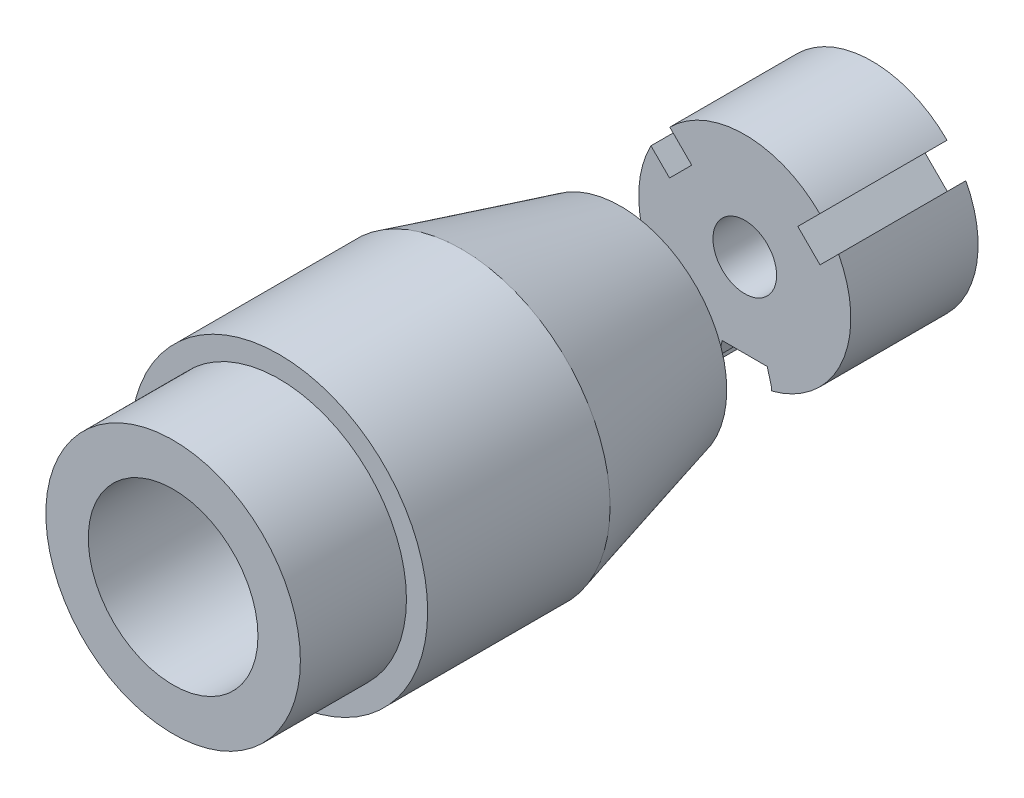
ISO-10303-21;
HEADER;
FILE_DESCRIPTION(('STEP AP214'),'2;1');
FILE_NAME('part.step','',(''),(''),'','','');
FILE_SCHEMA(('AUTOMOTIVE_DESIGN { 1 0 10303 214 1 1 1 1 }'));
ENDSEC;
DATA;
#1=APPLICATION_CONTEXT('core data for automotive mechanical design processes');
#2=APPLICATION_PROTOCOL_DEFINITION('international standard','automotive_design',2000,#1);
#3=PRODUCT_CONTEXT('',#1,'mechanical');
#4=PRODUCT('Part','Part','',(#3));
#5=PRODUCT_RELATED_PRODUCT_CATEGORY('part','',(#4));
#6=PRODUCT_DEFINITION_FORMATION('','',#4);
#7=PRODUCT_DEFINITION_CONTEXT('part definition',#1,'design');
#8=PRODUCT_DEFINITION('design','',#6,#7);
#9=PRODUCT_DEFINITION_SHAPE('','',#8);
#10=(LENGTH_UNIT() NAMED_UNIT(*) SI_UNIT(.MILLI.,.METRE.));
#11=(NAMED_UNIT(*) PLANE_ANGLE_UNIT() SI_UNIT($,.RADIAN.));
#12=(NAMED_UNIT(*) SI_UNIT($,.STERADIAN.) SOLID_ANGLE_UNIT());
#13=UNCERTAINTY_MEASURE_WITH_UNIT(LENGTH_MEASURE(1.E-05),#10,'distance_accuracy_value','');
#14=(GEOMETRIC_REPRESENTATION_CONTEXT(3) GLOBAL_UNCERTAINTY_ASSIGNED_CONTEXT((#13)) GLOBAL_UNIT_ASSIGNED_CONTEXT((#10,
#11,#12)) REPRESENTATION_CONTEXT('',''));
#15=CARTESIAN_POINT('',(0.,0.,0.));
#16=DIRECTION('',(0.,0.,1.));
#17=DIRECTION('',(1.,0.,0.));
#18=AXIS2_PLACEMENT_3D('',#15,#16,#17);
#19=CARTESIAN_POINT('',(0.,0.,59.2488093090686));
#20=DIRECTION('',(0.,0.,1.));
#21=DIRECTION('',(1.,0.,0.));
#22=AXIS2_PLACEMENT_3D('',#19,#20,#21);
#23=PLANE('',#22);
#24=CARTESIAN_POINT('',(0.,0.,59.2488093090686));
#25=DIRECTION('',(0.,0.,1.));
#26=DIRECTION('',(1.,0.,0.));
#27=AXIS2_PLACEMENT_3D('',#24,#25,#26);
#28=CIRCLE('',#27,14.6505502024933);
#29=CARTESIAN_POINT('',(14.6505502024933,0.,59.2488093090686));
#30=VERTEX_POINT('',#29);
#31=EDGE_CURVE('E173',#30,#30,#28,.T.);
#32=ORIENTED_EDGE('',*,*,#31,.T.);
#33=EDGE_LOOP('',(#32));
#34=FACE_BOUND('',#33,.T.);
#35=CARTESIAN_POINT('',(0.,0.,59.2488093090686));
#36=DIRECTION('',(0.,0.,1.));
#37=DIRECTION('',(1.,0.,0.));
#38=AXIS2_PLACEMENT_3D('',#35,#36,#37);
#39=CIRCLE('',#38,25.);
#40=CARTESIAN_POINT('',(25.,0.,59.2488093090686));
#41=VERTEX_POINT('',#40);
#42=EDGE_CURVE('E77',#41,#41,#39,.T.);
#43=ORIENTED_EDGE('',*,*,#42,.F.);
#44=EDGE_LOOP('',(#43));
#45=FACE_BOUND('',#44,.T.);
#46=ADVANCED_FACE('F61',(#34,#45),#23,.F.);
#47=CARTESIAN_POINT('',(0.,0.,59.2488093090686));
#48=DIRECTION('',(0.,0.,1.));
#49=DIRECTION('',(1.,0.,0.));
#50=AXIS2_PLACEMENT_3D('',#47,#48,#49);
#51=CONICAL_SURFACE('',#50,25.,0.260602391747341);
#52=ORIENTED_EDGE('',*,*,#42,.T.);
#53=EDGE_LOOP('',(#52));
#54=FACE_BOUND('',#53,.T.);
#55=CARTESIAN_POINT('',(0.,0.,96.7488093090686));
#56=DIRECTION('',(0.,0.,1.));
#57=DIRECTION('',(1.,0.,0.));
#58=AXIS2_PLACEMENT_3D('',#55,#56,#57);
#59=CIRCLE('',#58,35.);
#60=CARTESIAN_POINT('',(35.,0.,96.7488093090686));
#61=VERTEX_POINT('',#60);
#62=EDGE_CURVE('E66',#61,#61,#59,.T.);
#63=ORIENTED_EDGE('',*,*,#62,.F.);
#64=EDGE_LOOP('',(#63));
#65=FACE_BOUND('',#64,.T.);
#66=ADVANCED_FACE('F63',(#54,#65),#51,.T.);
#67=CARTESIAN_POINT('',(0.,0.,139.748809309069));
#68=DIRECTION('',(0.,0.,-1.));
#69=DIRECTION('',(-1.,0.,0.));
#70=AXIS2_PLACEMENT_3D('',#67,#68,#69);
#71=CYLINDRICAL_SURFACE('',#70,35.);
#72=CARTESIAN_POINT('',(0.,0.,139.748809309069));
#73=DIRECTION('',(0.,0.,1.));
#74=DIRECTION('',(1.,0.,0.));
#75=AXIS2_PLACEMENT_3D('',#72,#73,#74);
#76=CIRCLE('',#75,35.);
#77=CARTESIAN_POINT('',(35.,0.,139.748809309069));
#78=VERTEX_POINT('',#77);
#79=EDGE_CURVE('E82',#78,#78,#76,.T.);
#80=ORIENTED_EDGE('',*,*,#79,.F.);
#81=EDGE_LOOP('',(#80));
#82=FACE_BOUND('',#81,.T.);
#83=ORIENTED_EDGE('',*,*,#62,.T.);
#84=EDGE_LOOP('',(#83));
#85=FACE_BOUND('',#84,.T.);
#86=ADVANCED_FACE('F124',(#82,#85),#71,.T.);
#87=CARTESIAN_POINT('',(0.,0.,139.748809309069));
#88=DIRECTION('',(0.,0.,1.));
#89=DIRECTION('',(1.,0.,0.));
#90=AXIS2_PLACEMENT_3D('',#87,#88,#89);
#91=PLANE('',#90);
#92=CARTESIAN_POINT('',(0.,0.,139.748809309069));
#93=DIRECTION('',(0.,0.,1.));
#94=DIRECTION('',(1.,0.,0.));
#95=AXIS2_PLACEMENT_3D('',#92,#93,#94);
#96=CIRCLE('',#95,30.);
#97=CARTESIAN_POINT('',(30.,0.,139.748809309069));
#98=VERTEX_POINT('',#97);
#99=EDGE_CURVE('E12',#98,#98,#96,.T.);
#100=ORIENTED_EDGE('',*,*,#99,.F.);
#101=EDGE_LOOP('',(#100));
#102=FACE_BOUND('',#101,.T.);
#103=ORIENTED_EDGE('',*,*,#79,.T.);
#104=EDGE_LOOP('',(#103));
#105=FACE_BOUND('',#104,.T.);
#106=ADVANCED_FACE('F128',(#102,#105),#91,.T.);
#107=CARTESIAN_POINT('',(0.,0.,164.748809309069));
#108=DIRECTION('',(0.,0.,-1.));
#109=DIRECTION('',(-1.,0.,0.));
#110=AXIS2_PLACEMENT_3D('',#107,#108,#109);
#111=CYLINDRICAL_SURFACE('',#110,30.);
#112=CARTESIAN_POINT('',(0.,0.,164.748809309069));
#113=DIRECTION('',(0.,0.,1.));
#114=DIRECTION('',(1.,0.,0.));
#115=AXIS2_PLACEMENT_3D('',#112,#113,#114);
#116=CIRCLE('',#115,30.);
#117=CARTESIAN_POINT('',(30.,0.,164.748809309069));
#118=VERTEX_POINT('',#117);
#119=EDGE_CURVE('E80',#118,#118,#116,.T.);
#120=ORIENTED_EDGE('',*,*,#119,.F.);
#121=EDGE_LOOP('',(#120));
#122=FACE_BOUND('',#121,.T.);
#123=ORIENTED_EDGE('',*,*,#99,.T.);
#124=EDGE_LOOP('',(#123));
#125=FACE_BOUND('',#124,.T.);
#126=ADVANCED_FACE('F143',(#122,#125),#111,.T.);
#127=CARTESIAN_POINT('',(0.,0.,164.748809309069));
#128=DIRECTION('',(0.,0.,1.));
#129=DIRECTION('',(1.,0.,0.));
#130=AXIS2_PLACEMENT_3D('',#127,#128,#129);
#131=PLANE('',#130);
#132=CARTESIAN_POINT('',(0.,0.,164.748809309069));
#133=DIRECTION('',(0.,0.,1.));
#134=DIRECTION('',(1.,0.,0.));
#135=AXIS2_PLACEMENT_3D('',#132,#133,#134);
#136=CIRCLE('',#135,20.);
#137=CARTESIAN_POINT('',(20.,0.,164.748809309069));
#138=VERTEX_POINT('',#137);
#139=EDGE_CURVE('E190',#138,#138,#136,.T.);
#140=ORIENTED_EDGE('',*,*,#139,.F.);
#141=EDGE_LOOP('',(#140));
#142=FACE_BOUND('',#141,.T.);
#143=ORIENTED_EDGE('',*,*,#119,.T.);
#144=EDGE_LOOP('',(#143));
#145=FACE_BOUND('',#144,.T.);
#146=ADVANCED_FACE('F147',(#142,#145),#131,.T.);
#147=CARTESIAN_POINT('',(0.,0.,61.8254358146719));
#148=DIRECTION('',(0.,0.,1.));
#149=DIRECTION('',(1.,0.,0.));
#150=AXIS2_PLACEMENT_3D('',#147,#148,#149);
#151=CONICAL_SURFACE('',#150,15.3376506039875,0.260602391747341);
#152=ORIENTED_EDGE('',*,*,#31,.F.);
#153=EDGE_LOOP('',(#152));
#154=FACE_BOUND('',#153,.T.);
#155=CARTESIAN_POINT('',(0.,0.,98.0592460497187));
#156=DIRECTION('',(0.,0.,1.));
#157=DIRECTION('',(1.,0.,0.));
#158=AXIS2_PLACEMENT_3D('',#155,#156,#157);
#159=CIRCLE('',#158,25.);
#160=CARTESIAN_POINT('',(25.,0.,98.0592460497187));
#161=VERTEX_POINT('',#160);
#162=EDGE_CURVE('E176',#161,#161,#159,.T.);
#163=ORIENTED_EDGE('',*,*,#162,.T.);
#164=EDGE_LOOP('',(#163));
#165=FACE_BOUND('',#164,.T.);
#166=ADVANCED_FACE('F151',(#154,#165),#151,.F.);
#167=CARTESIAN_POINT('',(0.,0.,139.748809309069));
#168=DIRECTION('',(0.,0.,-1.));
#169=DIRECTION('',(-1.,0.,0.));
#170=AXIS2_PLACEMENT_3D('',#167,#168,#169);
#171=CYLINDRICAL_SURFACE('',#170,25.);
#172=CARTESIAN_POINT('',(0.,0.,129.748809309069));
#173=DIRECTION('',(0.,0.,1.));
#174=DIRECTION('',(1.,0.,0.));
#175=AXIS2_PLACEMENT_3D('',#172,#173,#174);
#176=CIRCLE('',#175,25.);
#177=CARTESIAN_POINT('',(25.,0.,129.748809309069));
#178=VERTEX_POINT('',#177);
#179=EDGE_CURVE('E185',#178,#178,#176,.T.);
#180=ORIENTED_EDGE('',*,*,#179,.T.);
#181=EDGE_LOOP('',(#180));
#182=FACE_BOUND('',#181,.T.);
#183=ORIENTED_EDGE('',*,*,#162,.F.);
#184=EDGE_LOOP('',(#183));
#185=FACE_BOUND('',#184,.T.);
#186=ADVANCED_FACE('F160',(#182,#185),#171,.F.);
#187=CARTESIAN_POINT('',(0.,0.,129.748809309069));
#188=DIRECTION('',(0.,0.,1.));
#189=DIRECTION('',(1.,0.,0.));
#190=AXIS2_PLACEMENT_3D('',#187,#188,#189);
#191=PLANE('',#190);
#192=CARTESIAN_POINT('',(0.,0.,129.748809309069));
#193=DIRECTION('',(0.,0.,1.));
#194=DIRECTION('',(1.,0.,0.));
#195=AXIS2_PLACEMENT_3D('',#192,#193,#194);
#196=CIRCLE('',#195,20.);
#197=CARTESIAN_POINT('',(20.,0.,129.748809309069));
#198=VERTEX_POINT('',#197);
#199=EDGE_CURVE('E179',#198,#198,#196,.T.);
#200=ORIENTED_EDGE('',*,*,#199,.T.);
#201=EDGE_LOOP('',(#200));
#202=FACE_BOUND('',#201,.T.);
#203=ORIENTED_EDGE('',*,*,#179,.F.);
#204=EDGE_LOOP('',(#203));
#205=FACE_BOUND('',#204,.T.);
#206=ADVANCED_FACE('F156',(#202,#205),#191,.F.);
#207=CARTESIAN_POINT('',(0.,0.,164.748809309069));
#208=DIRECTION('',(0.,0.,-1.));
#209=DIRECTION('',(-1.,0.,0.));
#210=AXIS2_PLACEMENT_3D('',#207,#208,#209);
#211=CYLINDRICAL_SURFACE('',#210,20.);
#212=ORIENTED_EDGE('',*,*,#139,.T.);
#213=EDGE_LOOP('',(#212));
#214=FACE_BOUND('',#213,.T.);
#215=ORIENTED_EDGE('',*,*,#199,.F.);
#216=EDGE_LOOP('',(#215));
#217=FACE_BOUND('',#216,.T.);
#218=ADVANCED_FACE('F153',(#214,#217),#211,.F.);
#219=CLOSED_SHELL('',(#46,#66,#86,#106,#126,#146,#166,#186,#206,#218));
#220=MANIFOLD_SOLID_BREP('B2',#219);
#221=CARTESIAN_POINT('',(0.,0.,30.));
#222=DIRECTION('',(-0.707106781186551,0.707106781186544,0.));
#223=DIRECTION('',(-0.707106781186544,-0.707106781186551,0.));
#224=AXIS2_PLACEMENT_3D('',#221,#222,#223);
#225=PLANE('',#224);
#226=DIRECTION('',(0.707106781186544,0.707106781186551,0.));
#227=VECTOR('',#226,1.);
#228=CARTESIAN_POINT('',(0.,0.,0.));
#229=LINE('',#228,#227);
#230=CARTESIAN_POINT('',(12.5,12.5,0.));
#231=VERTEX_POINT('',#230);
#232=CARTESIAN_POINT('',(17.6776695296637,17.6776695296637,0.));
#233=VERTEX_POINT('',#232);
#234=EDGE_CURVE('E462',#231,#233,#229,.T.);
#235=ORIENTED_EDGE('',*,*,#234,.T.);
#236=DIRECTION('',(0.,0.,-1.));
#237=VECTOR('',#236,1.);
#238=CARTESIAN_POINT('',(17.6776695296637,17.6776695296637,30.));
#239=LINE('',#238,#237);
#240=CARTESIAN_POINT('',(17.6776695296637,17.6776695296637,30.));
#241=VERTEX_POINT('',#240);
#242=EDGE_CURVE('E519',#241,#233,#239,.T.);
#243=ORIENTED_EDGE('',*,*,#242,.F.);
#244=DIRECTION('',(0.707106781186544,0.707106781186551,0.));
#245=VECTOR('',#244,1.);
#246=CARTESIAN_POINT('',(0.,0.,30.));
#247=LINE('',#246,#245);
#248=CARTESIAN_POINT('',(12.5,12.5,30.));
#249=VERTEX_POINT('',#248);
#250=EDGE_CURVE('E496',#249,#241,#247,.T.);
#251=ORIENTED_EDGE('',*,*,#250,.F.);
#252=DIRECTION('',(0.,0.,-1.));
#253=VECTOR('',#252,1.);
#254=CARTESIAN_POINT('',(12.5,12.5,30.));
#255=LINE('',#254,#253);
#256=EDGE_CURVE('E341',#249,#231,#255,.T.);
#257=ORIENTED_EDGE('',*,*,#256,.T.);
#258=EDGE_LOOP('',(#235,#243,#251,#257));
#259=FACE_BOUND('',#258,.T.);
#260=ADVANCED_FACE('F291',(#259),#225,.F.);
#261=CARTESIAN_POINT('',(0.,0.,30.));
#262=DIRECTION('',(0.,0.,-1.));
#263=DIRECTION('',(-1.,0.,0.));
#264=AXIS2_PLACEMENT_3D('',#261,#262,#263);
#265=CYLINDRICAL_SURFACE('',#264,25.);
#266=CARTESIAN_POINT('',(0.,0.,0.));
#267=DIRECTION('',(0.,0.,1.));
#268=DIRECTION('',(1.,0.,0.));
#269=AXIS2_PLACEMENT_3D('',#266,#267,#268);
#270=CIRCLE('',#269,25.);
#271=CARTESIAN_POINT('',(-17.6776695296637,17.6776695296637,0.));
#272=VERTEX_POINT('',#271);
#273=EDGE_CURVE('E464',#233,#272,#270,.T.);
#274=ORIENTED_EDGE('',*,*,#273,.T.);
#275=DIRECTION('',(0.,0.,-1.));
#276=VECTOR('',#275,1.);
#277=CARTESIAN_POINT('',(-17.6776695296637,17.6776695296637,30.));
#278=LINE('',#277,#276);
#279=CARTESIAN_POINT('',(-17.6776695296637,17.6776695296637,30.));
#280=VERTEX_POINT('',#279);
#281=EDGE_CURVE('E517',#280,#272,#278,.T.);
#282=ORIENTED_EDGE('',*,*,#281,.F.);
#283=CARTESIAN_POINT('',(0.,0.,30.));
#284=DIRECTION('',(0.,0.,1.));
#285=DIRECTION('',(1.,0.,0.));
#286=AXIS2_PLACEMENT_3D('',#283,#284,#285);
#287=CIRCLE('',#286,25.);
#288=EDGE_CURVE('E398',#241,#280,#287,.T.);
#289=ORIENTED_EDGE('',*,*,#288,.F.);
#290=ORIENTED_EDGE('',*,*,#242,.T.);
#291=EDGE_LOOP('',(#274,#282,#289,#290));
#292=FACE_BOUND('',#291,.T.);
#293=ADVANCED_FACE('F557',(#292),#265,.T.);
#294=CARTESIAN_POINT('',(0.,0.,30.));
#295=DIRECTION('',(-0.707106781186545,-0.70710678118655,0.));
#296=DIRECTION('',(0.70710678118655,-0.707106781186545,0.));
#297=AXIS2_PLACEMENT_3D('',#294,#295,#296);
#298=PLANE('',#297);
#299=DIRECTION('',(-0.70710678118655,0.707106781186545,0.));
#300=VECTOR('',#299,1.);
#301=CARTESIAN_POINT('',(0.,0.,0.));
#302=LINE('',#301,#300);
#303=CARTESIAN_POINT('',(-12.5,12.5,0.));
#304=VERTEX_POINT('',#303);
#305=EDGE_CURVE('E468',#304,#272,#302,.T.);
#306=ORIENTED_EDGE('',*,*,#305,.F.);
#307=DIRECTION('',(0.,0.,-1.));
#308=VECTOR('',#307,1.);
#309=CARTESIAN_POINT('',(-12.5,12.5,30.));
#310=LINE('',#309,#308);
#311=CARTESIAN_POINT('',(-12.5,12.5,30.));
#312=VERTEX_POINT('',#311);
#313=EDGE_CURVE('E515',#312,#304,#310,.T.);
#314=ORIENTED_EDGE('',*,*,#313,.F.);
#315=DIRECTION('',(-0.70710678118655,0.707106781186545,0.));
#316=VECTOR('',#315,1.);
#317=CARTESIAN_POINT('',(0.,0.,30.));
#318=LINE('',#317,#316);
#319=EDGE_CURVE('E621',#312,#280,#318,.T.);
#320=ORIENTED_EDGE('',*,*,#319,.T.);
#321=ORIENTED_EDGE('',*,*,#281,.T.);
#322=EDGE_LOOP('',(#306,#314,#320,#321));
#323=FACE_BOUND('',#322,.T.);
#324=ADVANCED_FACE('F558',(#323),#298,.T.);
#325=CARTESIAN_POINT('',(-12.5,12.5,30.));
#326=DIRECTION('',(-0.707106781186548,0.707106781186547,0.));
#327=DIRECTION('',(-0.707106781186547,-0.707106781186548,0.));
#328=AXIS2_PLACEMENT_3D('',#325,#326,#327);
#329=PLANE('',#328);
#330=DIRECTION('',(0.707106781186547,0.707106781186548,0.));
#331=VECTOR('',#330,1.);
#332=CARTESIAN_POINT('',(-12.5,12.5,0.));
#333=LINE('',#332,#331);
#334=CARTESIAN_POINT('',(-17.7372176693436,7.26278233065638,0.));
#335=VERTEX_POINT('',#334);
#336=EDGE_CURVE('E472',#335,#304,#333,.T.);
#337=ORIENTED_EDGE('',*,*,#336,.F.);
#338=DIRECTION('',(0.,0.,-1.));
#339=VECTOR('',#338,1.);
#340=CARTESIAN_POINT('',(-17.7372176693436,7.26278233065638,30.));
#341=LINE('',#340,#339);
#342=CARTESIAN_POINT('',(-17.7372176693436,7.26278233065638,30.));
#343=VERTEX_POINT('',#342);
#344=EDGE_CURVE('E513',#343,#335,#341,.T.);
#345=ORIENTED_EDGE('',*,*,#344,.F.);
#346=DIRECTION('',(0.707106781186547,0.707106781186548,0.));
#347=VECTOR('',#346,1.);
#348=CARTESIAN_POINT('',(-12.5,12.5,30.));
#349=LINE('',#348,#347);
#350=EDGE_CURVE('E624',#343,#312,#349,.T.);
#351=ORIENTED_EDGE('',*,*,#350,.T.);
#352=ORIENTED_EDGE('',*,*,#313,.T.);
#353=EDGE_LOOP('',(#337,#345,#351,#352));
#354=FACE_BOUND('',#353,.T.);
#355=ADVANCED_FACE('F561',(#354),#329,.T.);
#356=CARTESIAN_POINT('',(-5.23721766934362,-5.23721766934362,30.));
#357=DIRECTION('',(-0.707106781186547,-0.707106781186548,0.));
#358=DIRECTION('',(0.707106781186548,-0.707106781186547,0.));
#359=AXIS2_PLACEMENT_3D('',#356,#357,#358);
#360=PLANE('',#359);
#361=DIRECTION('',(-0.707106781186548,0.707106781186547,0.));
#362=VECTOR('',#361,1.);
#363=CARTESIAN_POINT('',(-5.23721766934362,-5.23721766934362,0.));
#364=LINE('',#363,#362);
#365=CARTESIAN_POINT('',(-22.1212797127002,11.646844374013,0.));
#366=VERTEX_POINT('',#365);
#367=EDGE_CURVE('E475',#335,#366,#364,.T.);
#368=ORIENTED_EDGE('',*,*,#367,.T.);
#369=DIRECTION('',(0.,0.,-1.));
#370=VECTOR('',#369,1.);
#371=CARTESIAN_POINT('',(-22.1212797127002,11.646844374013,30.));
#372=LINE('',#371,#370);
#373=CARTESIAN_POINT('',(-22.1212797127002,11.646844374013,30.));
#374=VERTEX_POINT('',#373);
#375=EDGE_CURVE('E510',#374,#366,#372,.T.);
#376=ORIENTED_EDGE('',*,*,#375,.F.);
#377=DIRECTION('',(-0.707106781186548,0.707106781186547,0.));
#378=VECTOR('',#377,1.);
#379=CARTESIAN_POINT('',(-5.23721766934362,-5.23721766934362,30.));
#380=LINE('',#379,#378);
#381=EDGE_CURVE('E627',#343,#374,#380,.T.);
#382=ORIENTED_EDGE('',*,*,#381,.F.);
#383=ORIENTED_EDGE('',*,*,#344,.T.);
#384=EDGE_LOOP('',(#368,#376,#382,#383));
#385=FACE_BOUND('',#384,.T.);
#386=ADVANCED_FACE('F565',(#385),#360,.F.);
#387=CARTESIAN_POINT('',(-6.27192560911144,-24.2004741514246,0.));
#388=VERTEX_POINT('',#387);
#389=EDGE_CURVE('E469',#366,#388,#270,.T.);
#390=ORIENTED_EDGE('',*,*,#389,.T.);
#391=DIRECTION('',(0.,0.,-1.));
#392=VECTOR('',#391,1.);
#393=CARTESIAN_POINT('',(-6.27192560911144,-24.2004741514246,30.));
#394=LINE('',#393,#392);
#395=CARTESIAN_POINT('',(-6.27192560911144,-24.2004741514246,30.));
#396=VERTEX_POINT('',#395);
#397=EDGE_CURVE('E508',#396,#388,#394,.T.);
#398=ORIENTED_EDGE('',*,*,#397,.F.);
#399=EDGE_CURVE('E445',#374,#396,#287,.T.);
#400=ORIENTED_EDGE('',*,*,#399,.F.);
#401=ORIENTED_EDGE('',*,*,#375,.T.);
#402=EDGE_LOOP('',(#390,#398,#400,#401));
#403=FACE_BOUND('',#402,.T.);
#404=ADVANCED_FACE('F569',(#403),#265,.T.);
#405=CARTESIAN_POINT('',(-6.27192560911144,0.,30.));
#406=DIRECTION('',(1.,0.,0.));
#407=DIRECTION('',(0.,0.,-1.));
#408=AXIS2_PLACEMENT_3D('',#405,#406,#407);
#409=PLANE('',#408);
#410=DIRECTION('',(0.,-1.,0.));
#411=VECTOR('',#410,1.);
#412=CARTESIAN_POINT('',(-6.27192560911144,0.,0.));
#413=LINE('',#412,#411);
#414=CARTESIAN_POINT('',(-6.27192560911144,-23.3126291508482,0.));
#415=VERTEX_POINT('',#414);
#416=EDGE_CURVE('E477',#415,#388,#413,.T.);
#417=ORIENTED_EDGE('',*,*,#416,.F.);
#418=DIRECTION('',(0.,0.,-1.));
#419=VECTOR('',#418,1.);
#420=CARTESIAN_POINT('',(-6.27192560911144,-23.3126291508482,30.));
#421=LINE('',#420,#419);
#422=CARTESIAN_POINT('',(-6.27192560911144,-23.3126291508482,30.));
#423=VERTEX_POINT('',#422);
#424=EDGE_CURVE('E506',#423,#415,#421,.T.);
#425=ORIENTED_EDGE('',*,*,#424,.F.);
#426=DIRECTION('',(0.,-1.,0.));
#427=VECTOR('',#426,1.);
#428=CARTESIAN_POINT('',(-6.27192560911144,0.,30.));
#429=LINE('',#428,#427);
#430=EDGE_CURVE('E629',#423,#396,#429,.T.);
#431=ORIENTED_EDGE('',*,*,#430,.T.);
#432=ORIENTED_EDGE('',*,*,#397,.T.);
#433=EDGE_LOOP('',(#417,#425,#431,#432));
#434=FACE_BOUND('',#433,.T.);
#435=ADVANCED_FACE('F571',(#434),#409,.T.);
#436=CARTESIAN_POINT('',(0.,0.,30.));
#437=DIRECTION('',(0.965663070658668,-0.25979767890817,0.));
#438=DIRECTION('',(0.25979767890817,0.965663070658668,0.));
#439=AXIS2_PLACEMENT_3D('',#436,#437,#438);
#440=PLANE('',#439);
#441=DIRECTION('',(-0.25979767890817,-0.965663070658668,0.));
#442=VECTOR('',#441,1.);
#443=CARTESIAN_POINT('',(0.,0.,0.));
#444=LINE('',#443,#442);
#445=CARTESIAN_POINT('',(-5.3,-19.7,0.));
#446=VERTEX_POINT('',#445);
#447=EDGE_CURVE('E480',#446,#415,#444,.T.);
#448=ORIENTED_EDGE('',*,*,#447,.F.);
#449=DIRECTION('',(0.,0.,-1.));
#450=VECTOR('',#449,1.);
#451=CARTESIAN_POINT('',(-5.3,-19.7,30.));
#452=LINE('',#451,#450);
#453=CARTESIAN_POINT('',(-5.3,-19.7,30.));
#454=VERTEX_POINT('',#453);
#455=EDGE_CURVE('E504',#454,#446,#452,.T.);
#456=ORIENTED_EDGE('',*,*,#455,.F.);
#457=DIRECTION('',(-0.25979767890817,-0.965663070658668,0.));
#458=VECTOR('',#457,1.);
#459=CARTESIAN_POINT('',(0.,0.,30.));
#460=LINE('',#459,#458);
#461=EDGE_CURVE('E632',#454,#423,#460,.T.);
#462=ORIENTED_EDGE('',*,*,#461,.T.);
#463=ORIENTED_EDGE('',*,*,#424,.T.);
#464=EDGE_LOOP('',(#448,#456,#462,#463));
#465=FACE_BOUND('',#464,.T.);
#466=ADVANCED_FACE('F574',(#465),#440,.T.);
#467=CARTESIAN_POINT('',(0.,-19.7,30.));
#468=DIRECTION('',(0.,-1.,0.));
#469=DIRECTION('',(0.,0.,-1.));
#470=AXIS2_PLACEMENT_3D('',#467,#468,#469);
#471=PLANE('',#470);
#472=DIRECTION('',(-1.,0.,0.));
#473=VECTOR('',#472,1.);
#474=CARTESIAN_POINT('',(0.,-19.7,0.));
#475=LINE('',#474,#473);
#476=CARTESIAN_POINT('',(5.3,-19.7,0.));
#477=VERTEX_POINT('',#476);
#478=EDGE_CURVE('E483',#477,#446,#475,.T.);
#479=ORIENTED_EDGE('',*,*,#478,.F.);
#480=DIRECTION('',(0.,0.,-1.));
#481=VECTOR('',#480,1.);
#482=CARTESIAN_POINT('',(5.3,-19.7,30.));
#483=LINE('',#482,#481);
#484=CARTESIAN_POINT('',(5.3,-19.7,30.));
#485=VERTEX_POINT('',#484);
#486=EDGE_CURVE('E502',#485,#477,#483,.T.);
#487=ORIENTED_EDGE('',*,*,#486,.F.);
#488=DIRECTION('',(-1.,0.,0.));
#489=VECTOR('',#488,1.);
#490=CARTESIAN_POINT('',(0.,-19.7,30.));
#491=LINE('',#490,#489);
#492=EDGE_CURVE('E635',#485,#454,#491,.T.);
#493=ORIENTED_EDGE('',*,*,#492,.T.);
#494=ORIENTED_EDGE('',*,*,#455,.T.);
#495=EDGE_LOOP('',(#479,#487,#493,#494));
#496=FACE_BOUND('',#495,.T.);
#497=ADVANCED_FACE('F578',(#496),#471,.T.);
#498=CARTESIAN_POINT('',(0.,0.,30.));
#499=DIRECTION('',(-0.965663070658668,-0.25979767890817,0.));
#500=DIRECTION('',(0.25979767890817,-0.965663070658668,0.));
#501=AXIS2_PLACEMENT_3D('',#498,#499,#500);
#502=PLANE('',#501);
#503=DIRECTION('',(-0.25979767890817,0.965663070658668,0.));
#504=VECTOR('',#503,1.);
#505=CARTESIAN_POINT('',(0.,0.,0.));
#506=LINE('',#505,#504);
#507=CARTESIAN_POINT('',(6.27192560911144,-23.3126291508482,0.));
#508=VERTEX_POINT('',#507);
#509=EDGE_CURVE('E486',#508,#477,#506,.T.);
#510=ORIENTED_EDGE('',*,*,#509,.F.);
#511=DIRECTION('',(0.,0.,-1.));
#512=VECTOR('',#511,1.);
#513=CARTESIAN_POINT('',(6.27192560911144,-23.3126291508482,30.));
#514=LINE('',#513,#512);
#515=CARTESIAN_POINT('',(6.27192560911144,-23.3126291508482,30.));
#516=VERTEX_POINT('',#515);
#517=EDGE_CURVE('E500',#516,#508,#514,.T.);
#518=ORIENTED_EDGE('',*,*,#517,.F.);
#519=DIRECTION('',(-0.25979767890817,0.965663070658668,0.));
#520=VECTOR('',#519,1.);
#521=CARTESIAN_POINT('',(0.,0.,30.));
#522=LINE('',#521,#520);
#523=EDGE_CURVE('E637',#516,#485,#522,.T.);
#524=ORIENTED_EDGE('',*,*,#523,.T.);
#525=ORIENTED_EDGE('',*,*,#486,.T.);
#526=EDGE_LOOP('',(#510,#518,#524,#525));
#527=FACE_BOUND('',#526,.T.);
#528=ADVANCED_FACE('F582',(#527),#502,.T.);
#529=CARTESIAN_POINT('',(6.27192560911144,0.,30.));
#530=DIRECTION('',(1.,0.,0.));
#531=DIRECTION('',(0.,0.,-1.));
#532=AXIS2_PLACEMENT_3D('',#529,#530,#531);
#533=PLANE('',#532);
#534=DIRECTION('',(0.,-1.,0.));
#535=VECTOR('',#534,1.);
#536=CARTESIAN_POINT('',(6.27192560911144,0.,0.));
#537=LINE('',#536,#535);
#538=CARTESIAN_POINT('',(6.27192560911144,-24.2004741514246,0.));
#539=VERTEX_POINT('',#538);
#540=EDGE_CURVE('E489',#508,#539,#537,.T.);
#541=ORIENTED_EDGE('',*,*,#540,.T.);
#542=DIRECTION('',(0.,0.,-1.));
#543=VECTOR('',#542,1.);
#544=CARTESIAN_POINT('',(6.27192560911144,-24.2004741514246,30.));
#545=LINE('',#544,#543);
#546=CARTESIAN_POINT('',(6.27192560911144,-24.2004741514246,30.));
#547=VERTEX_POINT('',#546);
#548=EDGE_CURVE('E453',#547,#539,#545,.T.);
#549=ORIENTED_EDGE('',*,*,#548,.F.);
#550=DIRECTION('',(0.,-1.,0.));
#551=VECTOR('',#550,1.);
#552=CARTESIAN_POINT('',(6.27192560911144,0.,30.));
#553=LINE('',#552,#551);
#554=EDGE_CURVE('E440',#516,#547,#553,.T.);
#555=ORIENTED_EDGE('',*,*,#554,.F.);
#556=ORIENTED_EDGE('',*,*,#517,.T.);
#557=EDGE_LOOP('',(#541,#549,#555,#556));
#558=FACE_BOUND('',#557,.T.);
#559=ADVANCED_FACE('F586',(#558),#533,.F.);
#560=CARTESIAN_POINT('',(22.1212797127002,11.646844374013,0.));
#561=VERTEX_POINT('',#560);
#562=EDGE_CURVE('E450',#539,#561,#270,.T.);
#563=ORIENTED_EDGE('',*,*,#562,.T.);
#564=DIRECTION('',(0.,0.,-1.));
#565=VECTOR('',#564,1.);
#566=CARTESIAN_POINT('',(22.1212797127002,11.646844374013,30.));
#567=LINE('',#566,#565);
#568=CARTESIAN_POINT('',(22.1212797127002,11.646844374013,30.));
#569=VERTEX_POINT('',#568);
#570=EDGE_CURVE('E447',#569,#561,#567,.T.);
#571=ORIENTED_EDGE('',*,*,#570,.F.);
#572=EDGE_CURVE('E432',#547,#569,#287,.T.);
#573=ORIENTED_EDGE('',*,*,#572,.F.);
#574=ORIENTED_EDGE('',*,*,#548,.T.);
#575=EDGE_LOOP('',(#563,#571,#573,#574));
#576=FACE_BOUND('',#575,.T.);
#577=ADVANCED_FACE('F448',(#576),#265,.T.);
#578=CARTESIAN_POINT('',(5.23721766934362,-5.23721766934362,30.));
#579=DIRECTION('',(-0.707106781186547,0.707106781186547,0.));
#580=DIRECTION('',(-0.707106781186548,-0.707106781186548,0.));
#581=AXIS2_PLACEMENT_3D('',#578,#579,#580);
#582=PLANE('',#581);
#583=DIRECTION('',(0.707106781186548,0.707106781186548,0.));
#584=VECTOR('',#583,1.);
#585=CARTESIAN_POINT('',(5.23721766934362,-5.23721766934362,0.));
#586=LINE('',#585,#584);
#587=CARTESIAN_POINT('',(17.7372176693436,7.26278233065638,0.));
#588=VERTEX_POINT('',#587);
#589=EDGE_CURVE('E491',#588,#561,#586,.T.);
#590=ORIENTED_EDGE('',*,*,#589,.F.);
#591=DIRECTION('',(0.,0.,-1.));
#592=VECTOR('',#591,1.);
#593=CARTESIAN_POINT('',(17.7372176693436,7.26278233065638,30.));
#594=LINE('',#593,#592);
#595=CARTESIAN_POINT('',(17.7372176693436,7.26278233065638,30.));
#596=VERTEX_POINT('',#595);
#597=EDGE_CURVE('E385',#596,#588,#594,.T.);
#598=ORIENTED_EDGE('',*,*,#597,.F.);
#599=DIRECTION('',(0.707106781186548,0.707106781186548,0.));
#600=VECTOR('',#599,1.);
#601=CARTESIAN_POINT('',(5.23721766934362,-5.23721766934362,30.));
#602=LINE('',#601,#600);
#603=EDGE_CURVE('E437',#596,#569,#602,.T.);
#604=ORIENTED_EDGE('',*,*,#603,.T.);
#605=ORIENTED_EDGE('',*,*,#570,.T.);
#606=EDGE_LOOP('',(#590,#598,#604,#605));
#607=FACE_BOUND('',#606,.T.);
#608=ADVANCED_FACE('F455',(#607),#582,.T.);
#609=CARTESIAN_POINT('',(12.5,12.5,30.));
#610=DIRECTION('',(0.707106781186548,0.707106781186547,0.));
#611=DIRECTION('',(-0.707106781186547,0.707106781186548,0.));
#612=AXIS2_PLACEMENT_3D('',#609,#610,#611);
#613=PLANE('',#612);
#614=DIRECTION('',(0.707106781186547,-0.707106781186548,0.));
#615=VECTOR('',#614,1.);
#616=CARTESIAN_POINT('',(12.5,12.5,0.));
#617=LINE('',#616,#615);
#618=EDGE_CURVE('E493',#231,#588,#617,.T.);
#619=ORIENTED_EDGE('',*,*,#618,.F.);
#620=ORIENTED_EDGE('',*,*,#256,.F.);
#621=DIRECTION('',(0.707106781186547,-0.707106781186548,0.));
#622=VECTOR('',#621,1.);
#623=CARTESIAN_POINT('',(12.5,12.5,30.));
#624=LINE('',#623,#622);
#625=EDGE_CURVE('E456',#249,#596,#624,.T.);
#626=ORIENTED_EDGE('',*,*,#625,.T.);
#627=ORIENTED_EDGE('',*,*,#597,.T.);
#628=EDGE_LOOP('',(#619,#620,#626,#627));
#629=FACE_BOUND('',#628,.T.);
#630=ADVANCED_FACE('F595',(#629),#613,.T.);
#631=CARTESIAN_POINT('',(0.,0.,30.));
#632=DIRECTION('',(0.,0.,1.));
#633=DIRECTION('',(1.,0.,0.));
#634=AXIS2_PLACEMENT_3D('',#631,#632,#633);
#635=PLANE('',#634);
#636=CARTESIAN_POINT('',(0.,0.,30.));
#637=DIRECTION('',(0.,0.,1.));
#638=DIRECTION('',(1.,0.,0.));
#639=AXIS2_PLACEMENT_3D('',#636,#637,#638);
#640=CIRCLE('',#639,7.5);
#641=CARTESIAN_POINT('',(7.5,0.,30.));
#642=VERTEX_POINT('',#641);
#643=EDGE_CURVE('E615',#642,#642,#640,.T.);
#644=ORIENTED_EDGE('',*,*,#643,.F.);
#645=EDGE_LOOP('',(#644));
#646=FACE_BOUND('',#645,.T.);
#647=ORIENTED_EDGE('',*,*,#250,.T.);
#648=ORIENTED_EDGE('',*,*,#288,.T.);
#649=ORIENTED_EDGE('',*,*,#319,.F.);
#650=ORIENTED_EDGE('',*,*,#350,.F.);
#651=ORIENTED_EDGE('',*,*,#381,.T.);
#652=ORIENTED_EDGE('',*,*,#399,.T.);
#653=ORIENTED_EDGE('',*,*,#430,.F.);
#654=ORIENTED_EDGE('',*,*,#461,.F.);
#655=ORIENTED_EDGE('',*,*,#492,.F.);
#656=ORIENTED_EDGE('',*,*,#523,.F.);
#657=ORIENTED_EDGE('',*,*,#554,.T.);
#658=ORIENTED_EDGE('',*,*,#572,.T.);
#659=ORIENTED_EDGE('',*,*,#603,.F.);
#660=ORIENTED_EDGE('',*,*,#625,.F.);
#661=EDGE_LOOP('',(#647,#648,#649,#650,#651,#652,#653,#654,#655,#656,#657,#658,#659,#660));
#662=FACE_BOUND('',#661,.T.);
#663=ADVANCED_FACE('F434',(#646,#662),#635,.T.);
#664=CARTESIAN_POINT('',(0.,0.,0.));
#665=DIRECTION('',(0.,0.,1.));
#666=DIRECTION('',(1.,0.,0.));
#667=AXIS2_PLACEMENT_3D('',#664,#665,#666);
#668=PLANE('',#667);
#669=ORIENTED_EDGE('',*,*,#234,.F.);
#670=ORIENTED_EDGE('',*,*,#618,.T.);
#671=ORIENTED_EDGE('',*,*,#589,.T.);
#672=ORIENTED_EDGE('',*,*,#562,.F.);
#673=ORIENTED_EDGE('',*,*,#540,.F.);
#674=ORIENTED_EDGE('',*,*,#509,.T.);
#675=ORIENTED_EDGE('',*,*,#478,.T.);
#676=ORIENTED_EDGE('',*,*,#447,.T.);
#677=ORIENTED_EDGE('',*,*,#416,.T.);
#678=ORIENTED_EDGE('',*,*,#389,.F.);
#679=ORIENTED_EDGE('',*,*,#367,.F.);
#680=ORIENTED_EDGE('',*,*,#336,.T.);
#681=ORIENTED_EDGE('',*,*,#305,.T.);
#682=ORIENTED_EDGE('',*,*,#273,.F.);
#683=EDGE_LOOP('',(#669,#670,#671,#672,#673,#674,#675,#676,#677,#678,#679,#680,#681,#682));
#684=FACE_BOUND('',#683,.T.);
#685=ADVANCED_FACE('F598',(#684),#668,.F.);
#686=CARTESIAN_POINT('',(0.,0.,17.));
#687=DIRECTION('',(0.,0.,1.));
#688=DIRECTION('',(1.,0.,0.));
#689=AXIS2_PLACEMENT_3D('',#686,#687,#688);
#690=CYLINDRICAL_SURFACE('',#689,7.5);
#691=CARTESIAN_POINT('',(0.,0.,17.));
#692=DIRECTION('',(0.,0.,1.));
#693=DIRECTION('',(1.,0.,0.));
#694=AXIS2_PLACEMENT_3D('',#691,#692,#693);
#695=CIRCLE('',#694,7.5);
#696=CARTESIAN_POINT('',(7.5,0.,17.));
#697=VERTEX_POINT('',#696);
#698=EDGE_CURVE('E465',#697,#697,#695,.T.);
#699=ORIENTED_EDGE('',*,*,#698,.F.);
#700=EDGE_LOOP('',(#699));
#701=FACE_BOUND('',#700,.T.);
#702=ORIENTED_EDGE('',*,*,#643,.T.);
#703=EDGE_LOOP('',(#702));
#704=FACE_BOUND('',#703,.T.);
#705=ADVANCED_FACE('F601',(#701,#704),#690,.F.);
#706=CARTESIAN_POINT('',(0.,0.,17.));
#707=DIRECTION('',(0.,0.,1.));
#708=DIRECTION('',(1.,0.,0.));
#709=AXIS2_PLACEMENT_3D('',#706,#707,#708);
#710=PLANE('',#709);
#711=ORIENTED_EDGE('',*,*,#698,.T.);
#712=EDGE_LOOP('',(#711));
#713=FACE_BOUND('',#712,.T.);
#714=ADVANCED_FACE('F608',(#713),#710,.T.);
#715=CLOSED_SHELL('',(#260,#293,#324,#355,#386,#404,#435,#466,#497,#528,#559,#577,#608,#630,
#663,#685,#705,#714));
#716=CARTESIAN_POINT('',(0.,0.,10.));
#717=DIRECTION('',(0.,0.,1.));
#718=DIRECTION('',(1.,0.,0.));
#719=AXIS2_PLACEMENT_3D('',#716,#717,#718);
#720=PLANE('',#719);
#721=DIRECTION('',(0.707106781186544,0.707106781186551,0.));
#722=VECTOR('',#721,1.);
#723=CARTESIAN_POINT('',(-7.07106781186544,7.07106781186537,10.));
#724=LINE('',#723,#722);
#725=CARTESIAN_POINT('',(0.,14.1421356237309,10.));
#726=VERTEX_POINT('',#725);
#727=CARTESIAN_POINT('',(0.834626338555523,14.9767619622864,10.));
#728=VERTEX_POINT('',#727);
#729=EDGE_CURVE('E526',#726,#728,#724,.T.);
#730=ORIENTED_EDGE('',*,*,#729,.T.);
#731=CARTESIAN_POINT('',(0.,0.,10.));
#732=DIRECTION('',(0.,0.,1.));
#733=DIRECTION('',(1.,0.,0.));
#734=AXIS2_PLACEMENT_3D('',#731,#732,#733);
#735=CIRCLE('',#734,15.);
#736=CARTESIAN_POINT('',(-0.834626338555446,14.9767619622864,10.));
#737=VERTEX_POINT('',#736);
#738=EDGE_CURVE('E327',#728,#737,#735,.T.);
#739=ORIENTED_EDGE('',*,*,#738,.T.);
#740=DIRECTION('',(-0.70710678118655,0.707106781186545,0.));
#741=VECTOR('',#740,1.);
#742=CARTESIAN_POINT('',(7.07106781186549,7.07106781186554,10.));
#743=LINE('',#742,#741);
#744=EDGE_CURVE('E295',#726,#737,#743,.T.);
#745=ORIENTED_EDGE('',*,*,#744,.F.);
#746=EDGE_LOOP('',(#730,#739,#745));
#747=FACE_BOUND('',#746,.T.);
#748=ADVANCED_FACE('F545',(#747),#720,.T.);
#749=CARTESIAN_POINT('',(0.,0.,20.));
#750=DIRECTION('',(0.,0.,1.));
#751=DIRECTION('',(1.,0.,0.));
#752=AXIS2_PLACEMENT_3D('',#749,#750,#751);
#753=PLANE('',#752);
#754=DIRECTION('',(-0.70710678118655,0.707106781186545,0.));
#755=VECTOR('',#754,1.);
#756=CARTESIAN_POINT('',(7.07106781186549,7.07106781186554,20.));
#757=LINE('',#756,#755);
#758=CARTESIAN_POINT('',(0.,14.1421356237309,20.));
#759=VERTEX_POINT('',#758);
#760=CARTESIAN_POINT('',(-0.834626338555446,14.9767619622864,20.));
#761=VERTEX_POINT('',#760);
#762=EDGE_CURVE('E302',#759,#761,#757,.T.);
#763=ORIENTED_EDGE('',*,*,#762,.T.);
#764=CARTESIAN_POINT('',(0.,0.,20.));
#765=DIRECTION('',(0.,0.,1.));
#766=DIRECTION('',(1.,0.,0.));
#767=AXIS2_PLACEMENT_3D('',#764,#765,#766);
#768=CIRCLE('',#767,15.);
#769=CARTESIAN_POINT('',(0.834626338555523,14.9767619622864,20.));
#770=VERTEX_POINT('',#769);
#771=EDGE_CURVE('E530',#770,#761,#768,.T.);
#772=ORIENTED_EDGE('',*,*,#771,.F.);
#773=DIRECTION('',(0.707106781186544,0.707106781186551,0.));
#774=VECTOR('',#773,1.);
#775=CARTESIAN_POINT('',(-7.07106781186544,7.07106781186537,20.));
#776=LINE('',#775,#774);
#777=EDGE_CURVE('E531',#759,#770,#776,.T.);
#778=ORIENTED_EDGE('',*,*,#777,.F.);
#779=EDGE_LOOP('',(#763,#772,#778));
#780=FACE_BOUND('',#779,.T.);
#781=ADVANCED_FACE('F536',(#780),#753,.F.);
#782=CARTESIAN_POINT('',(-7.07106781186544,7.07106781186537,30.));
#783=DIRECTION('',(-0.707106781186551,0.707106781186544,0.));
#784=DIRECTION('',(-0.707106781186544,-0.707106781186551,0.));
#785=AXIS2_PLACEMENT_3D('',#782,#783,#784);
#786=PLANE('',#785);
#787=ORIENTED_EDGE('',*,*,#777,.T.);
#788=DIRECTION('',(0.,0.,-1.));
#789=VECTOR('',#788,1.);
#790=CARTESIAN_POINT('',(0.834626338555523,14.9767619622864,20.));
#791=LINE('',#790,#789);
#792=EDGE_CURVE('E523',#770,#728,#791,.T.);
#793=ORIENTED_EDGE('',*,*,#792,.T.);
#794=ORIENTED_EDGE('',*,*,#729,.F.);
#795=DIRECTION('',(0.,0.,-1.));
#796=VECTOR('',#795,1.);
#797=CARTESIAN_POINT('',(0.,14.1421356237309,30.));
#798=LINE('',#797,#796);
#799=EDGE_CURVE('E311',#759,#726,#798,.T.);
#800=ORIENTED_EDGE('',*,*,#799,.F.);
#801=EDGE_LOOP('',(#787,#793,#794,#800));
#802=FACE_BOUND('',#801,.T.);
#803=ADVANCED_FACE('F533',(#802),#786,.T.);
#804=CARTESIAN_POINT('',(0.,0.,30.));
#805=DIRECTION('',(0.,0.,-1.));
#806=DIRECTION('',(-1.,0.,0.));
#807=AXIS2_PLACEMENT_3D('',#804,#805,#806);
#808=CYLINDRICAL_SURFACE('',#807,15.);
#809=ORIENTED_EDGE('',*,*,#738,.F.);
#810=ORIENTED_EDGE('',*,*,#792,.F.);
#811=ORIENTED_EDGE('',*,*,#771,.T.);
#812=DIRECTION('',(0.,0.,-1.));
#813=VECTOR('',#812,1.);
#814=CARTESIAN_POINT('',(-0.834626338555446,14.9767619622864,20.));
#815=LINE('',#814,#813);
#816=EDGE_CURVE('E59',#761,#737,#815,.T.);
#817=ORIENTED_EDGE('',*,*,#816,.T.);
#818=EDGE_LOOP('',(#809,#810,#811,#817));
#819=FACE_BOUND('',#818,.T.);
#820=ADVANCED_FACE('F537',(#819),#808,.F.);
#821=CARTESIAN_POINT('',(7.07106781186549,7.07106781186554,30.));
#822=DIRECTION('',(-0.707106781186545,-0.70710678118655,0.));
#823=DIRECTION('',(0.70710678118655,-0.707106781186545,0.));
#824=AXIS2_PLACEMENT_3D('',#821,#822,#823);
#825=PLANE('',#824);
#826=ORIENTED_EDGE('',*,*,#799,.T.);
#827=ORIENTED_EDGE('',*,*,#744,.T.);
#828=ORIENTED_EDGE('',*,*,#816,.F.);
#829=ORIENTED_EDGE('',*,*,#762,.F.);
#830=EDGE_LOOP('',(#826,#827,#828,#829));
#831=FACE_BOUND('',#830,.T.);
#832=ADVANCED_FACE('F293',(#831),#825,.F.);
#833=CLOSED_SHELL('',(#748,#781,#803,#820,#832));
#834=ORIENTED_CLOSED_SHELL('',*,#833,.T.);
#835=BREP_WITH_VOIDS('B7',#715,(#834));
#836=ADVANCED_BREP_SHAPE_REPRESENTATION('',(#18,#220,#835),#14);
#837=SHAPE_DEFINITION_REPRESENTATION(#9,#836);
ENDSEC;
END-ISO-10303-21;
